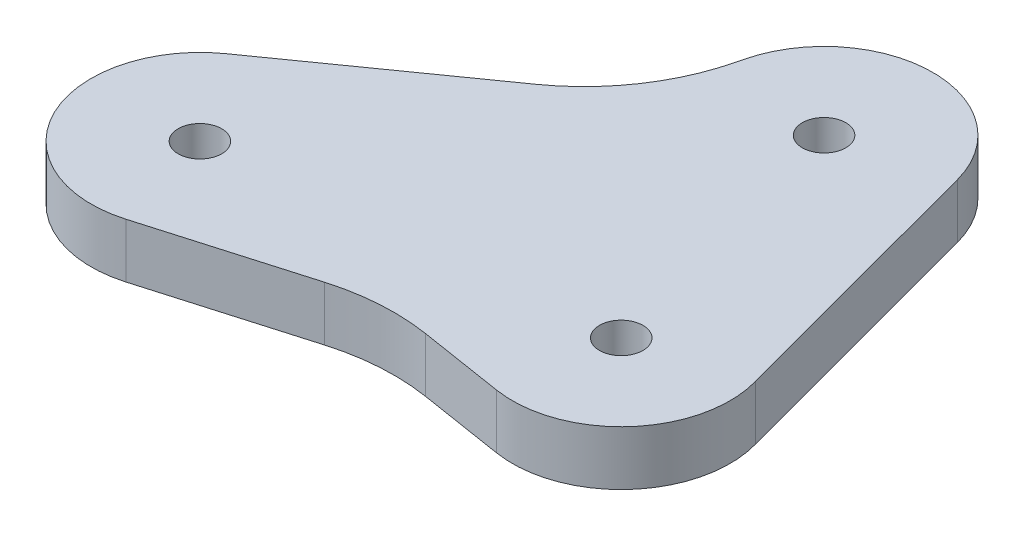
ISO-10303-21;
HEADER;
FILE_DESCRIPTION(('STEP AP214'),'2;1');
FILE_NAME('part.step','',(''),(''),'','','');
FILE_SCHEMA(('AUTOMOTIVE_DESIGN { 1 0 10303 214 1 1 1 1 }'));
ENDSEC;
DATA;
#1=APPLICATION_CONTEXT('core data for automotive mechanical design processes');
#2=APPLICATION_PROTOCOL_DEFINITION('international standard','automotive_design',2000,#1);
#3=PRODUCT_CONTEXT('',#1,'mechanical');
#4=PRODUCT('Part','Part','',(#3));
#5=PRODUCT_RELATED_PRODUCT_CATEGORY('part','',(#4));
#6=PRODUCT_DEFINITION_FORMATION('','',#4);
#7=PRODUCT_DEFINITION_CONTEXT('part definition',#1,'design');
#8=PRODUCT_DEFINITION('design','',#6,#7);
#9=PRODUCT_DEFINITION_SHAPE('','',#8);
#10=(LENGTH_UNIT() NAMED_UNIT(*) SI_UNIT(.MILLI.,.METRE.));
#11=(NAMED_UNIT(*) PLANE_ANGLE_UNIT() SI_UNIT($,.RADIAN.));
#12=(NAMED_UNIT(*) SI_UNIT($,.STERADIAN.) SOLID_ANGLE_UNIT());
#13=UNCERTAINTY_MEASURE_WITH_UNIT(LENGTH_MEASURE(1.E-05),#10,'distance_accuracy_value','');
#14=(GEOMETRIC_REPRESENTATION_CONTEXT(3) GLOBAL_UNCERTAINTY_ASSIGNED_CONTEXT((#13)) GLOBAL_UNIT_ASSIGNED_CONTEXT((#10,
#11,#12)) REPRESENTATION_CONTEXT('',''));
#15=CARTESIAN_POINT('',(0.,0.,0.));
#16=DIRECTION('',(0.,0.,1.));
#17=DIRECTION('',(1.,0.,0.));
#18=AXIS2_PLACEMENT_3D('',#15,#16,#17);
#19=CARTESIAN_POINT('',(-12.4473232729435,5.,7.18830522239326));
#20=DIRECTION('',(0.,-1.,0.));
#21=DIRECTION('',(0.,0.,-1.));
#22=AXIS2_PLACEMENT_3D('',#19,#20,#21);
#23=CYLINDRICAL_SURFACE('',#22,10.);
#24=CARTESIAN_POINT('',(-12.4473232729435,0.,7.18830522239326));
#25=DIRECTION('',(0.,1.,0.));
#26=DIRECTION('',(0.,0.,1.));
#27=AXIS2_PLACEMENT_3D('',#24,#25,#26);
#28=CIRCLE('',#27,10.);
#29=CARTESIAN_POINT('',(-18.2247814038649,0.,-0.973862231503444));
#30=VERTEX_POINT('',#29);
#31=CARTESIAN_POINT('',(-9.6548454678287,0.,16.7904959988745));
#32=VERTEX_POINT('',#31);
#33=EDGE_CURVE('E138',#30,#32,#28,.T.);
#34=ORIENTED_EDGE('',*,*,#33,.T.);
#35=DIRECTION('',(0.,-1.,0.));
#36=VECTOR('',#35,1.);
#37=CARTESIAN_POINT('',(-9.6548454678287,5.,16.7904959988745));
#38=LINE('',#37,#36);
#39=CARTESIAN_POINT('',(-9.6548454678287,5.,16.7904959988745));
#40=VERTEX_POINT('',#39);
#41=EDGE_CURVE('E118',#40,#32,#38,.T.);
#42=ORIENTED_EDGE('',*,*,#41,.F.);
#43=CARTESIAN_POINT('',(-12.4473232729435,5.,7.18830522239326));
#44=DIRECTION('',(0.,1.,0.));
#45=DIRECTION('',(0.,0.,1.));
#46=AXIS2_PLACEMENT_3D('',#43,#44,#45);
#47=CIRCLE('',#46,10.);
#48=CARTESIAN_POINT('',(-18.2247814038649,5.,-0.973862231503444));
#49=VERTEX_POINT('',#48);
#50=EDGE_CURVE('E124',#49,#40,#47,.T.);
#51=ORIENTED_EDGE('',*,*,#50,.F.);
#52=DIRECTION('',(0.,-1.,0.));
#53=VECTOR('',#52,1.);
#54=CARTESIAN_POINT('',(-18.2247814038649,5.,-0.973862231503444));
#55=LINE('',#54,#53);
#56=EDGE_CURVE('E212',#49,#30,#55,.T.);
#57=ORIENTED_EDGE('',*,*,#56,.T.);
#58=EDGE_LOOP('',(#34,#42,#51,#57));
#59=FACE_BOUND('',#58,.T.);
#60=ADVANCED_FACE('F40',(#59),#23,.T.);
#61=CARTESIAN_POINT('',(3.7493092705173,5.,12.8923434340623));
#62=DIRECTION('',(0.279247780511482,0.,0.960219077648122));
#63=DIRECTION('',(0.960219077648123,0.,-0.279247780511482));
#64=AXIS2_PLACEMENT_3D('',#61,#62,#63);
#65=PLANE('',#64);
#66=DIRECTION('',(-0.960219077648123,0.,0.279247780511482));
#67=VECTOR('',#66,1.);
#68=CARTESIAN_POINT('',(3.7493092705173,0.,12.8923434340623));
#69=LINE('',#68,#67);
#70=CARTESIAN_POINT('',(4.50192461887967,0.,12.6734702930247));
#71=VERTEX_POINT('',#70);
#72=EDGE_CURVE('E180',#71,#32,#69,.T.);
#73=ORIENTED_EDGE('',*,*,#72,.F.);
#74=DIRECTION('',(0.,-1.,0.));
#75=VECTOR('',#74,1.);
#76=CARTESIAN_POINT('',(4.50192461887967,5.,12.6734702930247));
#77=LINE('',#76,#75);
#78=CARTESIAN_POINT('',(4.50192461887967,5.,12.6734702930247));
#79=VERTEX_POINT('',#78);
#80=EDGE_CURVE('E56',#71,#79,#77,.F.);
#81=ORIENTED_EDGE('',*,*,#80,.T.);
#82=DIRECTION('',(-0.960219077648123,0.,0.279247780511482));
#83=VECTOR('',#82,1.);
#84=CARTESIAN_POINT('',(3.7493092705173,5.,12.8923434340623));
#85=LINE('',#84,#83);
#86=EDGE_CURVE('E114',#79,#40,#85,.T.);
#87=ORIENTED_EDGE('',*,*,#86,.T.);
#88=ORIENTED_EDGE('',*,*,#41,.T.);
#89=EDGE_LOOP('',(#73,#81,#87,#88));
#90=FACE_BOUND('',#89,.T.);
#91=ADVANCED_FACE('F116',(#90),#65,.T.);
#92=CARTESIAN_POINT('',(-1.55263602270243,5.,9.77939343176249));
#93=DIRECTION('',(-0.156802155329052,0.,0.98763003401282));
#94=DIRECTION('',(0.98763003401282,0.,0.156802155329052));
#95=AXIS2_PLACEMENT_3D('',#92,#93,#94);
#96=PLANE('',#95);
#97=DIRECTION('',(-0.98763003401282,0.,-0.156802155329052));
#98=VECTOR('',#97,1.);
#99=CARTESIAN_POINT('',(-1.55263602270243,5.,9.77939343176249));
#100=LINE('',#99,#98);
#101=CARTESIAN_POINT('',(20.984655173766,5.,13.3575509534877));
#102=VERTEX_POINT('',#101);
#103=CARTESIAN_POINT('',(13.2229233356903,5.,12.1252511657308));
#104=VERTEX_POINT('',#103);
#105=EDGE_CURVE('E123',#102,#104,#100,.T.);
#106=ORIENTED_EDGE('',*,*,#105,.T.);
#107=DIRECTION('',(0.,-1.,0.));
#108=VECTOR('',#107,1.);
#109=CARTESIAN_POINT('',(13.2229233356903,0.,12.1252511657308));
#110=LINE('',#109,#108);
#111=CARTESIAN_POINT('',(13.2229233356903,0.,12.1252511657308));
#112=VERTEX_POINT('',#111);
#113=EDGE_CURVE('E160',#104,#112,#110,.T.);
#114=ORIENTED_EDGE('',*,*,#113,.T.);
#115=DIRECTION('',(-0.98763003401282,0.,-0.156802155329052));
#116=VECTOR('',#115,1.);
#117=CARTESIAN_POINT('',(-1.55263602270243,0.,9.77939343176249));
#118=LINE('',#117,#116);
#119=CARTESIAN_POINT('',(20.984655173766,0.,13.3575509534877));
#120=VERTEX_POINT('',#119);
#121=EDGE_CURVE('E171',#120,#112,#118,.T.);
#122=ORIENTED_EDGE('',*,*,#121,.F.);
#123=DIRECTION('',(0.,-1.,0.));
#124=VECTOR('',#123,1.);
#125=CARTESIAN_POINT('',(20.984655173766,5.,13.3575509534877));
#126=LINE('',#125,#124);
#127=EDGE_CURVE('E141',#102,#120,#126,.T.);
#128=ORIENTED_EDGE('',*,*,#127,.F.);
#129=EDGE_LOOP('',(#106,#114,#122,#128));
#130=FACE_BOUND('',#129,.T.);
#131=ADVANCED_FACE('F170',(#130),#96,.T.);
#132=CARTESIAN_POINT('',(22.5526767270565,5.,3.48125061335952));
#133=DIRECTION('',(0.,-1.,0.));
#134=DIRECTION('',(0.,0.,-1.));
#135=AXIS2_PLACEMENT_3D('',#132,#133,#134);
#136=CYLINDRICAL_SURFACE('',#135,10.);
#137=CARTESIAN_POINT('',(22.5526767270565,0.,3.48125061335952));
#138=DIRECTION('',(0.,1.,0.));
#139=DIRECTION('',(0.,0.,1.));
#140=AXIS2_PLACEMENT_3D('',#137,#138,#139);
#141=CIRCLE('',#140,10.);
#142=CARTESIAN_POINT('',(32.174930969157,0.,0.758710751322918));
#143=VERTEX_POINT('',#142);
#144=EDGE_CURVE('E178',#120,#143,#141,.T.);
#145=ORIENTED_EDGE('',*,*,#144,.T.);
#146=DIRECTION('',(0.,-1.,0.));
#147=VECTOR('',#146,1.);
#148=CARTESIAN_POINT('',(32.174930969157,5.,0.758710751322918));
#149=LINE('',#148,#147);
#150=CARTESIAN_POINT('',(32.174930969157,5.,0.758710751322918));
#151=VERTEX_POINT('',#150);
#152=EDGE_CURVE('E148',#151,#143,#149,.T.);
#153=ORIENTED_EDGE('',*,*,#152,.F.);
#154=CARTESIAN_POINT('',(22.5526767270565,5.,3.48125061335952));
#155=DIRECTION('',(0.,1.,0.));
#156=DIRECTION('',(0.,0.,1.));
#157=AXIS2_PLACEMENT_3D('',#154,#155,#156);
#158=CIRCLE('',#157,10.);
#159=EDGE_CURVE('E248',#102,#151,#158,.T.);
#160=ORIENTED_EDGE('',*,*,#159,.F.);
#161=ORIENTED_EDGE('',*,*,#127,.T.);
#162=EDGE_LOOP('',(#145,#153,#160,#161));
#163=FACE_BOUND('',#162,.T.);
#164=ADVANCED_FACE('F303',(#163),#136,.T.);
#165=CARTESIAN_POINT('',(29.8372933137771,5.,-7.9808294838942));
#166=DIRECTION('',(-0.966039450194387,0.,0.258394621979882));
#167=DIRECTION('',(0.258394621979882,0.,0.966039450194387));
#168=AXIS2_PLACEMENT_3D('',#165,#166,#167);
#169=PLANE('',#168);
#170=DIRECTION('',(-0.258394621979882,0.,-0.966039450194387));
#171=VECTOR('',#170,1.);
#172=CARTESIAN_POINT('',(29.8372933137771,0.,-7.9808294838942));
#173=LINE('',#172,#171);
#174=CARTESIAN_POINT('',(25.4064054743133,0.,-24.5462379258775));
#175=VERTEX_POINT('',#174);
#176=EDGE_CURVE('E184',#143,#175,#173,.T.);
#177=ORIENTED_EDGE('',*,*,#176,.T.);
#178=DIRECTION('',(0.,-1.,0.));
#179=VECTOR('',#178,1.);
#180=CARTESIAN_POINT('',(25.4064054743133,5.,-24.5462379258775));
#181=LINE('',#180,#179);
#182=CARTESIAN_POINT('',(25.4064054743133,5.,-24.5462379258775));
#183=VERTEX_POINT('',#182);
#184=EDGE_CURVE('E220',#183,#175,#181,.T.);
#185=ORIENTED_EDGE('',*,*,#184,.F.);
#186=DIRECTION('',(-0.258394621979882,0.,-0.966039450194387));
#187=VECTOR('',#186,1.);
#188=CARTESIAN_POINT('',(29.8372933137771,5.,-7.9808294838942));
#189=LINE('',#188,#187);
#190=EDGE_CURVE('E230',#151,#183,#189,.T.);
#191=ORIENTED_EDGE('',*,*,#190,.F.);
#192=ORIENTED_EDGE('',*,*,#152,.T.);
#193=EDGE_LOOP('',(#177,#185,#191,#192));
#194=FACE_BOUND('',#193,.T.);
#195=ADVANCED_FACE('F228',(#194),#169,.F.);
#196=CARTESIAN_POINT('',(15.7460109723694,5.,-21.9622917060787));
#197=DIRECTION('',(0.,-1.,0.));
#198=DIRECTION('',(0.,0.,-1.));
#199=AXIS2_PLACEMENT_3D('',#196,#197,#198);
#200=CYLINDRICAL_SURFACE('',#199,10.0000000000001);
#201=CARTESIAN_POINT('',(15.7460109723694,0.,-21.9622917060787));
#202=DIRECTION('',(0.,1.,0.));
#203=DIRECTION('',(0.,0.,1.));
#204=AXIS2_PLACEMENT_3D('',#201,#202,#203);
#205=CIRCLE('',#204,10.0000000000001);
#206=CARTESIAN_POINT('',(6.0339202691004,0.,-24.344579298179));
#207=VERTEX_POINT('',#206);
#208=EDGE_CURVE('E191',#175,#207,#205,.T.);
#209=ORIENTED_EDGE('',*,*,#208,.T.);
#210=DIRECTION('',(0.,-1.,0.));
#211=VECTOR('',#210,1.);
#212=CARTESIAN_POINT('',(6.0339202691004,5.,-24.344579298179));
#213=LINE('',#212,#211);
#214=CARTESIAN_POINT('',(6.0339202691004,5.,-24.344579298179));
#215=VERTEX_POINT('',#214);
#216=EDGE_CURVE('E215',#215,#207,#213,.T.);
#217=ORIENTED_EDGE('',*,*,#216,.F.);
#218=CARTESIAN_POINT('',(15.7460109723694,5.,-21.9622917060787));
#219=DIRECTION('',(0.,1.,0.));
#220=DIRECTION('',(0.,0.,1.));
#221=AXIS2_PLACEMENT_3D('',#218,#219,#220);
#222=CIRCLE('',#221,10.0000000000001);
#223=EDGE_CURVE('E240',#183,#215,#222,.T.);
#224=ORIENTED_EDGE('',*,*,#223,.F.);
#225=ORIENTED_EDGE('',*,*,#184,.T.);
#226=EDGE_LOOP('',(#209,#217,#224,#225));
#227=FACE_BOUND('',#226,.T.);
#228=ADVANCED_FACE('F237',(#227),#200,.T.);
#229=CARTESIAN_POINT('',(0.058873892871695,5.,0.0144412309122768));
#230=DIRECTION('',(-0.971209070326903,0.,-0.238228759210036));
#231=DIRECTION('',(-0.238228759210036,0.,0.971209070326903));
#232=AXIS2_PLACEMENT_3D('',#229,#230,#231);
#233=PLANE('',#232);
#234=DIRECTION('',(0.238228759210036,0.,-0.971209070326903));
#235=VECTOR('',#234,1.);
#236=CARTESIAN_POINT('',(0.058873892871695,0.,0.0144412309122768));
#237=LINE('',#236,#235);
#238=CARTESIAN_POINT('',(5.88270397873452,0.,-23.7281019540014));
#239=VERTEX_POINT('',#238);
#240=EDGE_CURVE('E195',#239,#207,#237,.T.);
#241=ORIENTED_EDGE('',*,*,#240,.F.);
#242=DIRECTION('',(0.,-1.,0.));
#243=VECTOR('',#242,1.);
#244=CARTESIAN_POINT('',(5.88270397873452,5.,-23.7281019540014));
#245=LINE('',#244,#243);
#246=CARTESIAN_POINT('',(5.88270397873452,5.,-23.7281019540014));
#247=VERTEX_POINT('',#246);
#248=EDGE_CURVE('E146',#239,#247,#245,.F.);
#249=ORIENTED_EDGE('',*,*,#248,.T.);
#250=DIRECTION('',(0.238228759210036,0.,-0.971209070326903));
#251=VECTOR('',#250,1.);
#252=CARTESIAN_POINT('',(0.058873892871695,5.,0.0144412309122768));
#253=LINE('',#252,#251);
#254=EDGE_CURVE('E243',#247,#215,#253,.T.);
#255=ORIENTED_EDGE('',*,*,#254,.T.);
#256=ORIENTED_EDGE('',*,*,#216,.T.);
#257=EDGE_LOOP('',(#241,#249,#255,#256));
#258=FACE_BOUND('',#257,.T.);
#259=ADVANCED_FACE('F314',(#258),#233,.T.);
#260=CARTESIAN_POINT('',(15.7460109723694,5.,-21.9622917060787));
#261=DIRECTION('',(0.,-1.,0.));
#262=DIRECTION('',(0.,0.,-1.));
#263=AXIS2_PLACEMENT_3D('',#260,#261,#262);
#264=CYLINDRICAL_SURFACE('',#263,2.00000000000006);
#265=CARTESIAN_POINT('',(15.7460109723694,5.,-21.9622917060787));
#266=DIRECTION('',(0.,1.,0.));
#267=DIRECTION('',(0.,0.,1.));
#268=AXIS2_PLACEMENT_3D('',#265,#266,#267);
#269=CIRCLE('',#268,2.00000000000006);
#270=CARTESIAN_POINT('',(15.7460109723694,5.,-19.9622917060786));
#271=VERTEX_POINT('',#270);
#272=EDGE_CURVE('E258',#271,#271,#269,.T.);
#273=ORIENTED_EDGE('',*,*,#272,.T.);
#274=EDGE_LOOP('',(#273));
#275=FACE_BOUND('',#274,.T.);
#276=CARTESIAN_POINT('',(15.7460109723694,0.,-21.9622917060787));
#277=DIRECTION('',(0.,1.,0.));
#278=DIRECTION('',(0.,0.,1.));
#279=AXIS2_PLACEMENT_3D('',#276,#277,#278);
#280=CIRCLE('',#279,2.00000000000006);
#281=CARTESIAN_POINT('',(15.7460109723694,0.,-19.9622917060786));
#282=VERTEX_POINT('',#281);
#283=EDGE_CURVE('E205',#282,#282,#280,.T.);
#284=ORIENTED_EDGE('',*,*,#283,.F.);
#285=EDGE_LOOP('',(#284));
#286=FACE_BOUND('',#285,.T.);
#287=ADVANCED_FACE('F317',(#275,#286),#264,.F.);
#288=CARTESIAN_POINT('',(-12.4473232729435,5.,7.18830522239326));
#289=DIRECTION('',(0.,-1.,0.));
#290=DIRECTION('',(0.,0.,-1.));
#291=AXIS2_PLACEMENT_3D('',#288,#289,#290);
#292=CYLINDRICAL_SURFACE('',#291,2.);
#293=CARTESIAN_POINT('',(-12.4473232729435,5.,7.18830522239326));
#294=DIRECTION('',(0.,1.,0.));
#295=DIRECTION('',(0.,0.,1.));
#296=AXIS2_PLACEMENT_3D('',#293,#294,#295);
#297=CIRCLE('',#296,2.);
#298=CARTESIAN_POINT('',(-12.4473232729435,5.,9.18830522239326));
#299=VERTEX_POINT('',#298);
#300=EDGE_CURVE('E254',#299,#299,#297,.T.);
#301=ORIENTED_EDGE('',*,*,#300,.T.);
#302=EDGE_LOOP('',(#301));
#303=FACE_BOUND('',#302,.T.);
#304=CARTESIAN_POINT('',(-12.4473232729435,0.,7.18830522239326));
#305=DIRECTION('',(0.,1.,0.));
#306=DIRECTION('',(0.,0.,1.));
#307=AXIS2_PLACEMENT_3D('',#304,#305,#306);
#308=CIRCLE('',#307,2.);
#309=CARTESIAN_POINT('',(-12.4473232729435,0.,9.18830522239326));
#310=VERTEX_POINT('',#309);
#311=EDGE_CURVE('E201',#310,#310,#308,.T.);
#312=ORIENTED_EDGE('',*,*,#311,.F.);
#313=EDGE_LOOP('',(#312));
#314=FACE_BOUND('',#313,.T.);
#315=ADVANCED_FACE('F321',(#303,#314),#292,.F.);
#316=CARTESIAN_POINT('',(-6.54249400641306,5.,-9.24298029277847));
#317=DIRECTION('',(0.577745813092137,0.,0.81621674538967));
#318=DIRECTION('',(0.81621674538967,0.,-0.577745813092137));
#319=AXIS2_PLACEMENT_3D('',#316,#317,#318);
#320=PLANE('',#319);
#321=DIRECTION('',(-0.81621674538967,0.,0.577745813092137));
#322=VECTOR('',#321,1.);
#323=CARTESIAN_POINT('',(-6.54249400641306,5.,-9.24298029277847));
#324=LINE('',#323,#322);
#325=CARTESIAN_POINT('',(-1.59309790872604,5.,-12.7463302165883));
#326=VERTEX_POINT('',#325);
#327=EDGE_CURVE('E130',#326,#49,#324,.T.);
#328=ORIENTED_EDGE('',*,*,#327,.F.);
#329=DIRECTION('',(0.,-1.,0.));
#330=VECTOR('',#329,1.);
#331=CARTESIAN_POINT('',(-1.59309790872604,5.,-12.7463302165883));
#332=LINE('',#331,#330);
#333=CARTESIAN_POINT('',(-1.59309790872604,0.,-12.7463302165883));
#334=VERTEX_POINT('',#333);
#335=EDGE_CURVE('E140',#326,#334,#332,.T.);
#336=ORIENTED_EDGE('',*,*,#335,.T.);
#337=DIRECTION('',(-0.81621674538967,0.,0.577745813092137));
#338=VECTOR('',#337,1.);
#339=CARTESIAN_POINT('',(-6.54249400641306,0.,-9.24298029277847));
#340=LINE('',#339,#338);
#341=EDGE_CURVE('E198',#334,#30,#340,.T.);
#342=ORIENTED_EDGE('',*,*,#341,.T.);
#343=ORIENTED_EDGE('',*,*,#56,.F.);
#344=EDGE_LOOP('',(#328,#336,#342,#343));
#345=FACE_BOUND('',#344,.T.);
#346=ADVANCED_FACE('F279',(#345),#320,.F.);
#347=CARTESIAN_POINT('',(22.5526767270565,5.,3.48125061335952));
#348=DIRECTION('',(0.,-1.,0.));
#349=DIRECTION('',(0.,0.,-1.));
#350=AXIS2_PLACEMENT_3D('',#347,#348,#349);
#351=CYLINDRICAL_SURFACE('',#350,2.);
#352=CARTESIAN_POINT('',(22.5526767270565,5.,3.48125061335952));
#353=DIRECTION('',(0.,1.,0.));
#354=DIRECTION('',(0.,0.,1.));
#355=AXIS2_PLACEMENT_3D('',#352,#353,#354);
#356=CIRCLE('',#355,2.);
#357=CARTESIAN_POINT('',(22.5526767270565,5.,5.48125061335952));
#358=VERTEX_POINT('',#357);
#359=EDGE_CURVE('E216',#358,#358,#356,.T.);
#360=ORIENTED_EDGE('',*,*,#359,.T.);
#361=EDGE_LOOP('',(#360));
#362=FACE_BOUND('',#361,.T.);
#363=CARTESIAN_POINT('',(22.5526767270565,0.,3.48125061335952));
#364=DIRECTION('',(0.,1.,0.));
#365=DIRECTION('',(0.,0.,1.));
#366=AXIS2_PLACEMENT_3D('',#363,#364,#365);
#367=CIRCLE('',#366,2.);
#368=CARTESIAN_POINT('',(22.5526767270565,0.,5.48125061335952));
#369=VERTEX_POINT('',#368);
#370=EDGE_CURVE('E135',#369,#369,#367,.T.);
#371=ORIENTED_EDGE('',*,*,#370,.F.);
#372=EDGE_LOOP('',(#371));
#373=FACE_BOUND('',#372,.T.);
#374=ADVANCED_FACE('F267',(#362,#373),#351,.F.);
#375=CARTESIAN_POINT('',(0.,5.,0.));
#376=DIRECTION('',(0.,1.,0.));
#377=DIRECTION('',(0.,0.,1.));
#378=AXIS2_PLACEMENT_3D('',#375,#376,#377);
#379=PLANE('',#378);
#380=ORIENTED_EDGE('',*,*,#50,.T.);
#381=ORIENTED_EDGE('',*,*,#86,.F.);
#382=CARTESIAN_POINT('',(10.0868802291093,5.,31.8778518459872));
#383=DIRECTION('',(0.,1.,0.));
#384=DIRECTION('',(0.,0.,1.));
#385=AXIS2_PLACEMENT_3D('',#382,#383,#384);
#386=CIRCLE('',#385,20.);
#387=EDGE_CURVE('E11',#79,#104,#386,.F.);
#388=ORIENTED_EDGE('',*,*,#387,.T.);
#389=ORIENTED_EDGE('',*,*,#105,.F.);
#390=ORIENTED_EDGE('',*,*,#159,.T.);
#391=ORIENTED_EDGE('',*,*,#190,.T.);
#392=ORIENTED_EDGE('',*,*,#223,.T.);
#393=ORIENTED_EDGE('',*,*,#254,.F.);
#394=CARTESIAN_POINT('',(-12.5702683574766,5.,-28.2544483789921));
#395=DIRECTION('',(0.,1.,0.));
#396=DIRECTION('',(0.,0.,1.));
#397=AXIS2_PLACEMENT_3D('',#394,#395,#396);
#398=CIRCLE('',#397,19.);
#399=EDGE_CURVE('E157',#247,#326,#398,.F.);
#400=ORIENTED_EDGE('',*,*,#399,.T.);
#401=ORIENTED_EDGE('',*,*,#327,.T.);
#402=EDGE_LOOP('',(#380,#381,#388,#389,#390,#391,#392,#393,#400,#401));
#403=FACE_BOUND('',#402,.T.);
#404=ORIENTED_EDGE('',*,*,#300,.F.);
#405=EDGE_LOOP('',(#404));
#406=FACE_BOUND('',#405,.T.);
#407=ORIENTED_EDGE('',*,*,#272,.F.);
#408=EDGE_LOOP('',(#407));
#409=FACE_BOUND('',#408,.T.);
#410=ORIENTED_EDGE('',*,*,#359,.F.);
#411=EDGE_LOOP('',(#410));
#412=FACE_BOUND('',#411,.T.);
#413=ADVANCED_FACE('F127',(#403,#406,#409,#412),#379,.T.);
#414=CARTESIAN_POINT('',(0.,0.,0.));
#415=DIRECTION('',(0.,1.,0.));
#416=DIRECTION('',(0.,0.,1.));
#417=AXIS2_PLACEMENT_3D('',#414,#415,#416);
#418=PLANE('',#417);
#419=ORIENTED_EDGE('',*,*,#33,.F.);
#420=ORIENTED_EDGE('',*,*,#341,.F.);
#421=CARTESIAN_POINT('',(-12.5702683574766,0.,-28.2544483789921));
#422=DIRECTION('',(0.,1.,0.));
#423=DIRECTION('',(0.,0.,1.));
#424=AXIS2_PLACEMENT_3D('',#421,#422,#423);
#425=CIRCLE('',#424,19.);
#426=EDGE_CURVE('E154',#334,#239,#425,.T.);
#427=ORIENTED_EDGE('',*,*,#426,.T.);
#428=ORIENTED_EDGE('',*,*,#240,.T.);
#429=ORIENTED_EDGE('',*,*,#208,.F.);
#430=ORIENTED_EDGE('',*,*,#176,.F.);
#431=ORIENTED_EDGE('',*,*,#144,.F.);
#432=ORIENTED_EDGE('',*,*,#121,.T.);
#433=CARTESIAN_POINT('',(10.0868802291093,0.,31.8778518459872));
#434=DIRECTION('',(0.,1.,0.));
#435=DIRECTION('',(0.,0.,1.));
#436=AXIS2_PLACEMENT_3D('',#433,#434,#435);
#437=CIRCLE('',#436,20.);
#438=EDGE_CURVE('E49',#112,#71,#437,.T.);
#439=ORIENTED_EDGE('',*,*,#438,.T.);
#440=ORIENTED_EDGE('',*,*,#72,.T.);
#441=EDGE_LOOP('',(#419,#420,#427,#428,#429,#430,#431,#432,#439,#440));
#442=FACE_BOUND('',#441,.T.);
#443=ORIENTED_EDGE('',*,*,#311,.T.);
#444=EDGE_LOOP('',(#443));
#445=FACE_BOUND('',#444,.T.);
#446=ORIENTED_EDGE('',*,*,#283,.T.);
#447=EDGE_LOOP('',(#446));
#448=FACE_BOUND('',#447,.T.);
#449=ORIENTED_EDGE('',*,*,#370,.T.);
#450=EDGE_LOOP('',(#449));
#451=FACE_BOUND('',#450,.T.);
#452=ADVANCED_FACE('F175',(#442,#445,#448,#451),#418,.F.);
#453=CARTESIAN_POINT('',(-12.5702683574766,5.,-28.2544483789921));
#454=DIRECTION('',(0.,-1.,0.));
#455=DIRECTION('',(0.,0.,-1.));
#456=AXIS2_PLACEMENT_3D('',#453,#454,#455);
#457=CYLINDRICAL_SURFACE('',#456,19.);
#458=ORIENTED_EDGE('',*,*,#399,.F.);
#459=ORIENTED_EDGE('',*,*,#248,.F.);
#460=ORIENTED_EDGE('',*,*,#426,.F.);
#461=ORIENTED_EDGE('',*,*,#335,.F.);
#462=EDGE_LOOP('',(#458,#459,#460,#461));
#463=FACE_BOUND('',#462,.T.);
#464=ADVANCED_FACE('F276',(#463),#457,.F.);
#465=CARTESIAN_POINT('',(10.0868802291093,5.,31.8778518459872));
#466=DIRECTION('',(0.,1.,0.));
#467=DIRECTION('',(0.,0.,1.));
#468=AXIS2_PLACEMENT_3D('',#465,#466,#467);
#469=CYLINDRICAL_SURFACE('',#468,20.);
#470=ORIENTED_EDGE('',*,*,#387,.F.);
#471=ORIENTED_EDGE('',*,*,#80,.F.);
#472=ORIENTED_EDGE('',*,*,#438,.F.);
#473=ORIENTED_EDGE('',*,*,#113,.F.);
#474=EDGE_LOOP('',(#470,#471,#472,#473));
#475=FACE_BOUND('',#474,.T.);
#476=ADVANCED_FACE('F42',(#475),#469,.F.);
#477=CLOSED_SHELL('',(#60,#91,#131,#164,#195,#228,#259,#287,#315,#346,#374,#413,#452,#464,#476));
#478=MANIFOLD_SOLID_BREP('B2',#477);
#479=ADVANCED_BREP_SHAPE_REPRESENTATION('',(#18,#478),#14);
#480=SHAPE_DEFINITION_REPRESENTATION(#9,#479);
ENDSEC;
END-ISO-10303-21;
